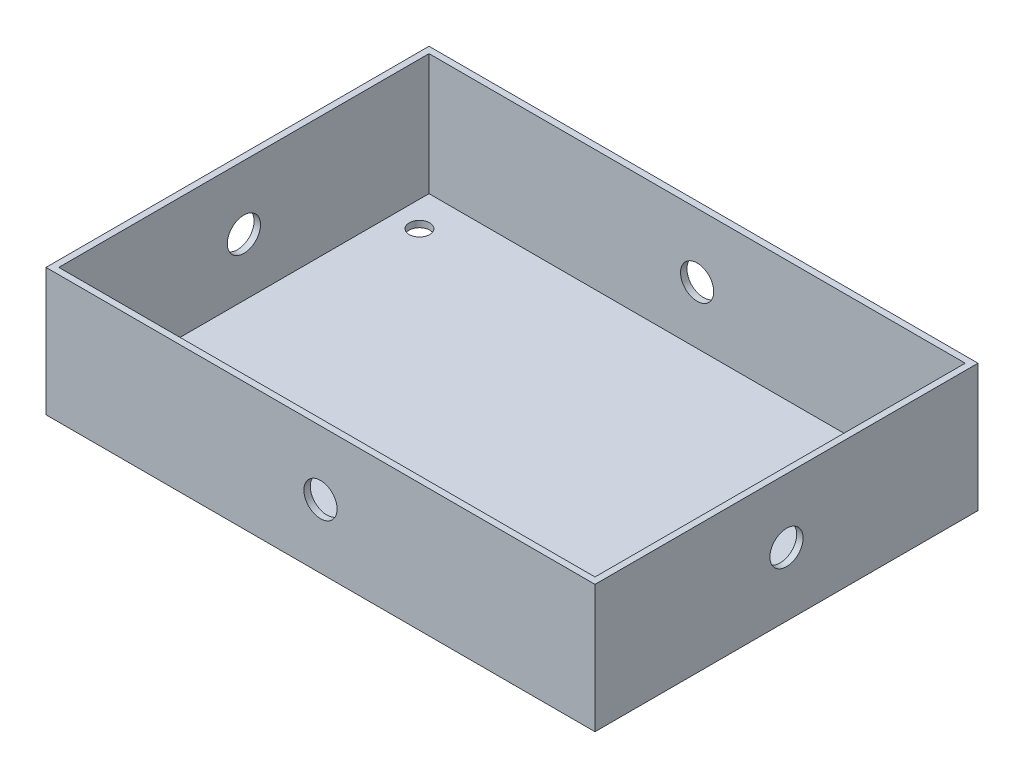
ISO-10303-21;
HEADER;
FILE_DESCRIPTION(('STEP AP214'),'2;1');
FILE_NAME('part.step','',(''),(''),'','','');
FILE_SCHEMA(('AUTOMOTIVE_DESIGN { 1 0 10303 214 1 1 1 1 }'));
ENDSEC;
DATA;
#1=APPLICATION_CONTEXT('core data for automotive mechanical design processes');
#2=APPLICATION_PROTOCOL_DEFINITION('international standard','automotive_design',2000,#1);
#3=PRODUCT_CONTEXT('',#1,'mechanical');
#4=PRODUCT('Part','Part','',(#3));
#5=PRODUCT_RELATED_PRODUCT_CATEGORY('part','',(#4));
#6=PRODUCT_DEFINITION_FORMATION('','',#4);
#7=PRODUCT_DEFINITION_CONTEXT('part definition',#1,'design');
#8=PRODUCT_DEFINITION('design','',#6,#7);
#9=PRODUCT_DEFINITION_SHAPE('','',#8);
#10=(LENGTH_UNIT() NAMED_UNIT(*) SI_UNIT(.MILLI.,.METRE.));
#11=(NAMED_UNIT(*) PLANE_ANGLE_UNIT() SI_UNIT($,.RADIAN.));
#12=(NAMED_UNIT(*) SI_UNIT($,.STERADIAN.) SOLID_ANGLE_UNIT());
#13=UNCERTAINTY_MEASURE_WITH_UNIT(LENGTH_MEASURE(1.E-05),#10,'distance_accuracy_value','');
#14=(GEOMETRIC_REPRESENTATION_CONTEXT(3) GLOBAL_UNCERTAINTY_ASSIGNED_CONTEXT((#13)) GLOBAL_UNIT_ASSIGNED_CONTEXT((#10,
#11,#12)) REPRESENTATION_CONTEXT('',''));
#15=CARTESIAN_POINT('',(0.,0.,0.));
#16=DIRECTION('',(0.,0.,1.));
#17=DIRECTION('',(1.,0.,0.));
#18=AXIS2_PLACEMENT_3D('',#15,#16,#17);
#19=CARTESIAN_POINT('',(43.,20.,30.));
#20=DIRECTION('',(-1.,0.,0.));
#21=DIRECTION('',(0.,0.,1.));
#22=AXIS2_PLACEMENT_3D('',#19,#20,#21);
#23=PLANE('',#22);
#24=CARTESIAN_POINT('',(43.,10.,0.));
#25=DIRECTION('',(-1.,0.,0.));
#26=DIRECTION('',(0.,0.,1.));
#27=AXIS2_PLACEMENT_3D('',#24,#25,#26);
#28=CIRCLE('',#27,2.6);
#29=CARTESIAN_POINT('',(43.,10.,2.6));
#30=VERTEX_POINT('',#29);
#31=EDGE_CURVE('E172',#30,#30,#28,.T.);
#32=ORIENTED_EDGE('',*,*,#31,.T.);
#33=EDGE_LOOP('',(#32));
#34=FACE_BOUND('',#33,.T.);
#35=DIRECTION('',(0.,0.,-1.));
#36=VECTOR('',#35,1.);
#37=CARTESIAN_POINT('',(43.,0.,30.));
#38=LINE('',#37,#36);
#39=CARTESIAN_POINT('',(43.,0.,30.));
#40=VERTEX_POINT('',#39);
#41=CARTESIAN_POINT('',(43.,0.,-30.));
#42=VERTEX_POINT('',#41);
#43=EDGE_CURVE('E150',#40,#42,#38,.T.);
#44=ORIENTED_EDGE('',*,*,#43,.T.);
#45=DIRECTION('',(0.,-1.,0.));
#46=VECTOR('',#45,1.);
#47=CARTESIAN_POINT('',(43.,20.,-30.));
#48=LINE('',#47,#46);
#49=CARTESIAN_POINT('',(43.,20.,-30.));
#50=VERTEX_POINT('',#49);
#51=EDGE_CURVE('E12',#50,#42,#48,.T.);
#52=ORIENTED_EDGE('',*,*,#51,.F.);
#53=DIRECTION('',(0.,0.,-1.));
#54=VECTOR('',#53,1.);
#55=CARTESIAN_POINT('',(43.,20.,30.));
#56=LINE('',#55,#54);
#57=CARTESIAN_POINT('',(43.,20.,30.));
#58=VERTEX_POINT('',#57);
#59=EDGE_CURVE('E151',#58,#50,#56,.T.);
#60=ORIENTED_EDGE('',*,*,#59,.F.);
#61=DIRECTION('',(0.,-1.,0.));
#62=VECTOR('',#61,1.);
#63=CARTESIAN_POINT('',(43.,20.,30.));
#64=LINE('',#63,#62);
#65=EDGE_CURVE('E157',#58,#40,#64,.T.);
#66=ORIENTED_EDGE('',*,*,#65,.T.);
#67=EDGE_LOOP('',(#44,#52,#60,#66));
#68=FACE_BOUND('',#67,.T.);
#69=ADVANCED_FACE('F37',(#34,#68),#23,.F.);
#70=CARTESIAN_POINT('',(-43.,20.,-30.));
#71=DIRECTION('',(0.,0.,1.));
#72=DIRECTION('',(1.,0.,0.));
#73=AXIS2_PLACEMENT_3D('',#70,#71,#72);
#74=PLANE('',#73);
#75=CARTESIAN_POINT('',(0.,10.,-30.));
#76=DIRECTION('',(0.,0.,-1.));
#77=DIRECTION('',(-1.,0.,0.));
#78=AXIS2_PLACEMENT_3D('',#75,#76,#77);
#79=CIRCLE('',#78,2.6);
#80=CARTESIAN_POINT('',(-2.59999999999999,10.,-30.));
#81=VERTEX_POINT('',#80);
#82=EDGE_CURVE('E267',#81,#81,#79,.T.);
#83=ORIENTED_EDGE('',*,*,#82,.F.);
#84=EDGE_LOOP('',(#83));
#85=FACE_BOUND('',#84,.T.);
#86=DIRECTION('',(-1.,0.,0.));
#87=VECTOR('',#86,1.);
#88=CARTESIAN_POINT('',(-43.,0.,-30.));
#89=LINE('',#88,#87);
#90=CARTESIAN_POINT('',(-43.,0.,-30.));
#91=VERTEX_POINT('',#90);
#92=EDGE_CURVE('E160',#42,#91,#89,.T.);
#93=ORIENTED_EDGE('',*,*,#92,.T.);
#94=DIRECTION('',(0.,-1.,0.));
#95=VECTOR('',#94,1.);
#96=CARTESIAN_POINT('',(-43.,20.,-30.));
#97=LINE('',#96,#95);
#98=CARTESIAN_POINT('',(-43.,20.,-30.));
#99=VERTEX_POINT('',#98);
#100=EDGE_CURVE('E45',#99,#91,#97,.T.);
#101=ORIENTED_EDGE('',*,*,#100,.F.);
#102=DIRECTION('',(-1.,0.,0.));
#103=VECTOR('',#102,1.);
#104=CARTESIAN_POINT('',(-43.,20.,-30.));
#105=LINE('',#104,#103);
#106=EDGE_CURVE('E90',#50,#99,#105,.T.);
#107=ORIENTED_EDGE('',*,*,#106,.F.);
#108=ORIENTED_EDGE('',*,*,#51,.T.);
#109=EDGE_LOOP('',(#93,#101,#107,#108));
#110=FACE_BOUND('',#109,.T.);
#111=ADVANCED_FACE('F226',(#85,#110),#74,.F.);
#112=CARTESIAN_POINT('',(-43.,20.,30.));
#113=DIRECTION('',(1.,0.,0.));
#114=DIRECTION('',(0.,0.,-1.));
#115=AXIS2_PLACEMENT_3D('',#112,#113,#114);
#116=PLANE('',#115);
#117=CARTESIAN_POINT('',(-43.,10.,0.));
#118=DIRECTION('',(-1.,0.,0.));
#119=DIRECTION('',(0.,0.,1.));
#120=AXIS2_PLACEMENT_3D('',#117,#118,#119);
#121=CIRCLE('',#120,2.6);
#122=CARTESIAN_POINT('',(-43.,10.,2.6));
#123=VERTEX_POINT('',#122);
#124=EDGE_CURVE('E179',#123,#123,#121,.T.);
#125=ORIENTED_EDGE('',*,*,#124,.F.);
#126=EDGE_LOOP('',(#125));
#127=FACE_BOUND('',#126,.T.);
#128=DIRECTION('',(0.,0.,1.));
#129=VECTOR('',#128,1.);
#130=CARTESIAN_POINT('',(-43.,0.,30.));
#131=LINE('',#130,#129);
#132=CARTESIAN_POINT('',(-43.,0.,30.));
#133=VERTEX_POINT('',#132);
#134=EDGE_CURVE('E162',#91,#133,#131,.T.);
#135=ORIENTED_EDGE('',*,*,#134,.T.);
#136=DIRECTION('',(0.,-1.,0.));
#137=VECTOR('',#136,1.);
#138=CARTESIAN_POINT('',(-43.,20.,30.));
#139=LINE('',#138,#137);
#140=CARTESIAN_POINT('',(-43.,20.,30.));
#141=VERTEX_POINT('',#140);
#142=EDGE_CURVE('E166',#141,#133,#139,.T.);
#143=ORIENTED_EDGE('',*,*,#142,.F.);
#144=DIRECTION('',(0.,0.,1.));
#145=VECTOR('',#144,1.);
#146=CARTESIAN_POINT('',(-43.,20.,30.));
#147=LINE('',#146,#145);
#148=EDGE_CURVE('E154',#99,#141,#147,.T.);
#149=ORIENTED_EDGE('',*,*,#148,.F.);
#150=ORIENTED_EDGE('',*,*,#100,.T.);
#151=EDGE_LOOP('',(#135,#143,#149,#150));
#152=FACE_BOUND('',#151,.T.);
#153=ADVANCED_FACE('F231',(#127,#152),#116,.F.);
#154=CARTESIAN_POINT('',(-43.,20.,30.));
#155=DIRECTION('',(0.,0.,-1.));
#156=DIRECTION('',(-1.,0.,0.));
#157=AXIS2_PLACEMENT_3D('',#154,#155,#156);
#158=PLANE('',#157);
#159=CARTESIAN_POINT('',(0.,10.,30.));
#160=DIRECTION('',(0.,0.,-1.));
#161=DIRECTION('',(-1.,0.,0.));
#162=AXIS2_PLACEMENT_3D('',#159,#160,#161);
#163=CIRCLE('',#162,2.6);
#164=CARTESIAN_POINT('',(-2.59999999999999,10.,30.));
#165=VERTEX_POINT('',#164);
#166=EDGE_CURVE('E265',#165,#165,#163,.T.);
#167=ORIENTED_EDGE('',*,*,#166,.T.);
#168=EDGE_LOOP('',(#167));
#169=FACE_BOUND('',#168,.T.);
#170=DIRECTION('',(1.,0.,0.));
#171=VECTOR('',#170,1.);
#172=CARTESIAN_POINT('',(-43.,0.,30.));
#173=LINE('',#172,#171);
#174=EDGE_CURVE('E83',#133,#40,#173,.T.);
#175=ORIENTED_EDGE('',*,*,#174,.T.);
#176=ORIENTED_EDGE('',*,*,#65,.F.);
#177=DIRECTION('',(1.,0.,0.));
#178=VECTOR('',#177,1.);
#179=CARTESIAN_POINT('',(-43.,20.,30.));
#180=LINE('',#179,#178);
#181=EDGE_CURVE('E62',#141,#58,#180,.T.);
#182=ORIENTED_EDGE('',*,*,#181,.F.);
#183=ORIENTED_EDGE('',*,*,#142,.T.);
#184=EDGE_LOOP('',(#175,#176,#182,#183));
#185=FACE_BOUND('',#184,.T.);
#186=ADVANCED_FACE('F220',(#169,#185),#158,.F.);
#187=CARTESIAN_POINT('',(0.,20.,0.));
#188=DIRECTION('',(0.,-1.,0.));
#189=DIRECTION('',(0.,0.,-1.));
#190=AXIS2_PLACEMENT_3D('',#187,#188,#189);
#191=PLANE('',#190);
#192=DIRECTION('',(0.,0.,1.));
#193=VECTOR('',#192,1.);
#194=CARTESIAN_POINT('',(-42.,20.,-29.));
#195=LINE('',#194,#193);
#196=CARTESIAN_POINT('',(-42.,20.,-29.));
#197=VERTEX_POINT('',#196);
#198=CARTESIAN_POINT('',(-42.,20.,29.));
#199=VERTEX_POINT('',#198);
#200=EDGE_CURVE('E136',#197,#199,#195,.T.);
#201=ORIENTED_EDGE('',*,*,#200,.F.);
#202=DIRECTION('',(-1.,0.,0.));
#203=VECTOR('',#202,1.);
#204=CARTESIAN_POINT('',(-42.,20.,-29.));
#205=LINE('',#204,#203);
#206=CARTESIAN_POINT('',(42.,20.,-29.));
#207=VERTEX_POINT('',#206);
#208=EDGE_CURVE('E129',#207,#197,#205,.T.);
#209=ORIENTED_EDGE('',*,*,#208,.F.);
#210=DIRECTION('',(0.,0.,-1.));
#211=VECTOR('',#210,1.);
#212=CARTESIAN_POINT('',(42.,20.,-29.));
#213=LINE('',#212,#211);
#214=CARTESIAN_POINT('',(42.,20.,29.));
#215=VERTEX_POINT('',#214);
#216=EDGE_CURVE('E140',#215,#207,#213,.T.);
#217=ORIENTED_EDGE('',*,*,#216,.F.);
#218=DIRECTION('',(1.,0.,0.));
#219=VECTOR('',#218,1.);
#220=CARTESIAN_POINT('',(-42.,20.,29.));
#221=LINE('',#220,#219);
#222=EDGE_CURVE('E53',#199,#215,#221,.T.);
#223=ORIENTED_EDGE('',*,*,#222,.F.);
#224=EDGE_LOOP('',(#201,#209,#217,#223));
#225=FACE_BOUND('',#224,.T.);
#226=ORIENTED_EDGE('',*,*,#59,.T.);
#227=ORIENTED_EDGE('',*,*,#106,.T.);
#228=ORIENTED_EDGE('',*,*,#148,.T.);
#229=ORIENTED_EDGE('',*,*,#181,.T.);
#230=EDGE_LOOP('',(#226,#227,#228,#229));
#231=FACE_BOUND('',#230,.T.);
#232=ADVANCED_FACE('F217',(#225,#231),#191,.F.);
#233=CARTESIAN_POINT('',(0.,0.,0.));
#234=DIRECTION('',(0.,-1.,0.));
#235=DIRECTION('',(0.,0.,-1.));
#236=AXIS2_PLACEMENT_3D('',#233,#234,#235);
#237=PLANE('',#236);
#238=CARTESIAN_POINT('',(-38.,0.,-23.5));
#239=DIRECTION('',(0.,-1.,0.));
#240=DIRECTION('',(0.,0.,1.));
#241=AXIS2_PLACEMENT_3D('',#238,#239,#240);
#242=CIRCLE('',#241,1.6);
#243=CARTESIAN_POINT('',(-38.,0.,-21.9));
#244=VERTEX_POINT('',#243);
#245=EDGE_CURVE('E176',#244,#244,#242,.T.);
#246=ORIENTED_EDGE('',*,*,#245,.F.);
#247=EDGE_LOOP('',(#246));
#248=FACE_BOUND('',#247,.T.);
#249=CARTESIAN_POINT('',(38.,0.,-23.5));
#250=DIRECTION('',(0.,-1.,0.));
#251=DIRECTION('',(0.,0.,-1.));
#252=AXIS2_PLACEMENT_3D('',#249,#250,#251);
#253=CIRCLE('',#252,1.6);
#254=CARTESIAN_POINT('',(38.,0.,-25.1));
#255=VERTEX_POINT('',#254);
#256=EDGE_CURVE('E199',#255,#255,#253,.T.);
#257=ORIENTED_EDGE('',*,*,#256,.F.);
#258=EDGE_LOOP('',(#257));
#259=FACE_BOUND('',#258,.T.);
#260=CARTESIAN_POINT('',(38.,0.,23.5));
#261=DIRECTION('',(0.,-1.,0.));
#262=DIRECTION('',(0.,0.,1.));
#263=AXIS2_PLACEMENT_3D('',#260,#261,#262);
#264=CIRCLE('',#263,1.6);
#265=CARTESIAN_POINT('',(38.,0.,25.1));
#266=VERTEX_POINT('',#265);
#267=EDGE_CURVE('E193',#266,#266,#264,.T.);
#268=ORIENTED_EDGE('',*,*,#267,.F.);
#269=EDGE_LOOP('',(#268));
#270=FACE_BOUND('',#269,.T.);
#271=CARTESIAN_POINT('',(-38.,0.,23.5));
#272=DIRECTION('',(0.,-1.,0.));
#273=DIRECTION('',(0.,0.,-1.));
#274=AXIS2_PLACEMENT_3D('',#271,#272,#273);
#275=CIRCLE('',#274,1.6);
#276=CARTESIAN_POINT('',(-38.,0.,21.9));
#277=VERTEX_POINT('',#276);
#278=EDGE_CURVE('E192',#277,#277,#275,.T.);
#279=ORIENTED_EDGE('',*,*,#278,.F.);
#280=EDGE_LOOP('',(#279));
#281=FACE_BOUND('',#280,.T.);
#282=ORIENTED_EDGE('',*,*,#43,.F.);
#283=ORIENTED_EDGE('',*,*,#174,.F.);
#284=ORIENTED_EDGE('',*,*,#134,.F.);
#285=ORIENTED_EDGE('',*,*,#92,.F.);
#286=EDGE_LOOP('',(#282,#283,#284,#285));
#287=FACE_BOUND('',#286,.T.);
#288=ADVANCED_FACE('F219',(#248,#259,#270,#281,#287),#237,.T.);
#289=CARTESIAN_POINT('',(0.,1.,0.));
#290=DIRECTION('',(0.,-1.,0.));
#291=DIRECTION('',(0.,0.,-1.));
#292=AXIS2_PLACEMENT_3D('',#289,#290,#291);
#293=PLANE('',#292);
#294=CARTESIAN_POINT('',(-38.,1.,-23.5));
#295=DIRECTION('',(0.,-1.,0.));
#296=DIRECTION('',(0.,0.,1.));
#297=AXIS2_PLACEMENT_3D('',#294,#295,#296);
#298=CIRCLE('',#297,1.6);
#299=CARTESIAN_POINT('',(-38.,1.,-21.9));
#300=VERTEX_POINT('',#299);
#301=EDGE_CURVE('E202',#300,#300,#298,.T.);
#302=ORIENTED_EDGE('',*,*,#301,.T.);
#303=EDGE_LOOP('',(#302));
#304=FACE_BOUND('',#303,.T.);
#305=CARTESIAN_POINT('',(38.,1.,-23.5));
#306=DIRECTION('',(0.,-1.,0.));
#307=DIRECTION('',(0.,0.,-1.));
#308=AXIS2_PLACEMENT_3D('',#305,#306,#307);
#309=CIRCLE('',#308,1.6);
#310=CARTESIAN_POINT('',(38.,1.,-25.1));
#311=VERTEX_POINT('',#310);
#312=EDGE_CURVE('E196',#311,#311,#309,.T.);
#313=ORIENTED_EDGE('',*,*,#312,.T.);
#314=EDGE_LOOP('',(#313));
#315=FACE_BOUND('',#314,.T.);
#316=CARTESIAN_POINT('',(38.,1.,23.5));
#317=DIRECTION('',(0.,-1.,0.));
#318=DIRECTION('',(0.,0.,1.));
#319=AXIS2_PLACEMENT_3D('',#316,#317,#318);
#320=CIRCLE('',#319,1.6);
#321=CARTESIAN_POINT('',(38.,1.,25.1));
#322=VERTEX_POINT('',#321);
#323=EDGE_CURVE('E189',#322,#322,#320,.T.);
#324=ORIENTED_EDGE('',*,*,#323,.T.);
#325=EDGE_LOOP('',(#324));
#326=FACE_BOUND('',#325,.T.);
#327=CARTESIAN_POINT('',(-38.,1.,23.5));
#328=DIRECTION('',(0.,-1.,0.));
#329=DIRECTION('',(0.,0.,-1.));
#330=AXIS2_PLACEMENT_3D('',#327,#328,#329);
#331=CIRCLE('',#330,1.6);
#332=CARTESIAN_POINT('',(-38.,1.,21.9));
#333=VERTEX_POINT('',#332);
#334=EDGE_CURVE('E207',#333,#333,#331,.T.);
#335=ORIENTED_EDGE('',*,*,#334,.T.);
#336=EDGE_LOOP('',(#335));
#337=FACE_BOUND('',#336,.T.);
#338=DIRECTION('',(0.,0.,-1.));
#339=VECTOR('',#338,1.);
#340=CARTESIAN_POINT('',(42.,1.,-29.));
#341=LINE('',#340,#339);
#342=CARTESIAN_POINT('',(42.,1.,29.));
#343=VERTEX_POINT('',#342);
#344=CARTESIAN_POINT('',(42.,1.,-29.));
#345=VERTEX_POINT('',#344);
#346=EDGE_CURVE('E133',#343,#345,#341,.T.);
#347=ORIENTED_EDGE('',*,*,#346,.T.);
#348=DIRECTION('',(-1.,0.,0.));
#349=VECTOR('',#348,1.);
#350=CARTESIAN_POINT('',(-42.,1.,-29.));
#351=LINE('',#350,#349);
#352=CARTESIAN_POINT('',(-42.,1.,-29.));
#353=VERTEX_POINT('',#352);
#354=EDGE_CURVE('E126',#345,#353,#351,.T.);
#355=ORIENTED_EDGE('',*,*,#354,.T.);
#356=DIRECTION('',(0.,0.,1.));
#357=VECTOR('',#356,1.);
#358=CARTESIAN_POINT('',(-42.,1.,-29.));
#359=LINE('',#358,#357);
#360=CARTESIAN_POINT('',(-42.,1.,29.));
#361=VERTEX_POINT('',#360);
#362=EDGE_CURVE('E113',#353,#361,#359,.T.);
#363=ORIENTED_EDGE('',*,*,#362,.T.);
#364=DIRECTION('',(1.,0.,0.));
#365=VECTOR('',#364,1.);
#366=CARTESIAN_POINT('',(-42.,1.,29.));
#367=LINE('',#366,#365);
#368=EDGE_CURVE('E145',#361,#343,#367,.T.);
#369=ORIENTED_EDGE('',*,*,#368,.T.);
#370=EDGE_LOOP('',(#347,#355,#363,#369));
#371=FACE_BOUND('',#370,.T.);
#372=ADVANCED_FACE('F132',(#304,#315,#326,#337,#371),#293,.F.);
#373=CARTESIAN_POINT('',(-42.,-102.078401241399,-29.));
#374=DIRECTION('',(0.,0.,-1.));
#375=DIRECTION('',(-1.,0.,0.));
#376=AXIS2_PLACEMENT_3D('',#373,#374,#375);
#377=PLANE('',#376);
#378=CARTESIAN_POINT('',(0.,10.,-29.));
#379=DIRECTION('',(0.,0.,-1.));
#380=DIRECTION('',(-1.,0.,0.));
#381=AXIS2_PLACEMENT_3D('',#378,#379,#380);
#382=CIRCLE('',#381,2.6);
#383=CARTESIAN_POINT('',(-2.59999999999999,10.,-29.));
#384=VERTEX_POINT('',#383);
#385=EDGE_CURVE('E184',#384,#384,#382,.T.);
#386=ORIENTED_EDGE('',*,*,#385,.T.);
#387=EDGE_LOOP('',(#386));
#388=FACE_BOUND('',#387,.T.);
#389=DIRECTION('',(0.,1.,0.));
#390=VECTOR('',#389,1.);
#391=CARTESIAN_POINT('',(42.,-102.078401241399,-29.));
#392=LINE('',#391,#390);
#393=EDGE_CURVE('E143',#345,#207,#392,.T.);
#394=ORIENTED_EDGE('',*,*,#393,.T.);
#395=ORIENTED_EDGE('',*,*,#208,.T.);
#396=DIRECTION('',(0.,1.,0.));
#397=VECTOR('',#396,1.);
#398=CARTESIAN_POINT('',(-42.,-102.078401241399,-29.));
#399=LINE('',#398,#397);
#400=EDGE_CURVE('E117',#353,#197,#399,.T.);
#401=ORIENTED_EDGE('',*,*,#400,.F.);
#402=ORIENTED_EDGE('',*,*,#354,.F.);
#403=EDGE_LOOP('',(#394,#395,#401,#402));
#404=FACE_BOUND('',#403,.T.);
#405=ADVANCED_FACE('F125',(#388,#404),#377,.F.);
#406=CARTESIAN_POINT('',(-42.,-102.078401241399,-29.));
#407=DIRECTION('',(-1.,0.,0.));
#408=DIRECTION('',(0.,0.,1.));
#409=AXIS2_PLACEMENT_3D('',#406,#407,#408);
#410=PLANE('',#409);
#411=CARTESIAN_POINT('',(-42.,10.,0.));
#412=DIRECTION('',(-1.,0.,0.));
#413=DIRECTION('',(0.,0.,1.));
#414=AXIS2_PLACEMENT_3D('',#411,#412,#413);
#415=CIRCLE('',#414,2.6);
#416=CARTESIAN_POINT('',(-42.,10.,2.6));
#417=VERTEX_POINT('',#416);
#418=EDGE_CURVE('E171',#417,#417,#415,.T.);
#419=ORIENTED_EDGE('',*,*,#418,.T.);
#420=EDGE_LOOP('',(#419));
#421=FACE_BOUND('',#420,.T.);
#422=ORIENTED_EDGE('',*,*,#400,.T.);
#423=ORIENTED_EDGE('',*,*,#200,.T.);
#424=DIRECTION('',(0.,1.,0.));
#425=VECTOR('',#424,1.);
#426=CARTESIAN_POINT('',(-42.,-102.078401241399,29.));
#427=LINE('',#426,#425);
#428=EDGE_CURVE('E119',#361,#199,#427,.T.);
#429=ORIENTED_EDGE('',*,*,#428,.F.);
#430=ORIENTED_EDGE('',*,*,#362,.F.);
#431=EDGE_LOOP('',(#422,#423,#429,#430));
#432=FACE_BOUND('',#431,.T.);
#433=ADVANCED_FACE('F115',(#421,#432),#410,.F.);
#434=CARTESIAN_POINT('',(-42.,-102.078401241399,29.));
#435=DIRECTION('',(0.,0.,1.));
#436=DIRECTION('',(1.,0.,0.));
#437=AXIS2_PLACEMENT_3D('',#434,#435,#436);
#438=PLANE('',#437);
#439=CARTESIAN_POINT('',(0.,10.,29.));
#440=DIRECTION('',(0.,0.,1.));
#441=DIRECTION('',(1.,0.,0.));
#442=AXIS2_PLACEMENT_3D('',#439,#440,#441);
#443=CIRCLE('',#442,2.6);
#444=CARTESIAN_POINT('',(2.60000000000001,10.,29.));
#445=VERTEX_POINT('',#444);
#446=EDGE_CURVE('E40',#445,#445,#443,.T.);
#447=ORIENTED_EDGE('',*,*,#446,.T.);
#448=EDGE_LOOP('',(#447));
#449=FACE_BOUND('',#448,.T.);
#450=ORIENTED_EDGE('',*,*,#428,.T.);
#451=ORIENTED_EDGE('',*,*,#222,.T.);
#452=DIRECTION('',(0.,1.,0.));
#453=VECTOR('',#452,1.);
#454=CARTESIAN_POINT('',(42.,-102.078401241399,29.));
#455=LINE('',#454,#453);
#456=EDGE_CURVE('E144',#343,#215,#455,.T.);
#457=ORIENTED_EDGE('',*,*,#456,.F.);
#458=ORIENTED_EDGE('',*,*,#368,.F.);
#459=EDGE_LOOP('',(#450,#451,#457,#458));
#460=FACE_BOUND('',#459,.T.);
#461=ADVANCED_FACE('F285',(#449,#460),#438,.F.);
#462=CARTESIAN_POINT('',(42.,-102.078401241399,-29.));
#463=DIRECTION('',(1.,0.,0.));
#464=DIRECTION('',(0.,0.,-1.));
#465=AXIS2_PLACEMENT_3D('',#462,#463,#464);
#466=PLANE('',#465);
#467=CARTESIAN_POINT('',(42.,10.,0.));
#468=DIRECTION('',(1.,0.,0.));
#469=DIRECTION('',(0.,0.,-1.));
#470=AXIS2_PLACEMENT_3D('',#467,#468,#469);
#471=CIRCLE('',#470,2.6);
#472=CARTESIAN_POINT('',(42.,10.,-2.6));
#473=VERTEX_POINT('',#472);
#474=EDGE_CURVE('E169',#473,#473,#471,.T.);
#475=ORIENTED_EDGE('',*,*,#474,.T.);
#476=EDGE_LOOP('',(#475));
#477=FACE_BOUND('',#476,.T.);
#478=ORIENTED_EDGE('',*,*,#456,.T.);
#479=ORIENTED_EDGE('',*,*,#216,.T.);
#480=ORIENTED_EDGE('',*,*,#393,.F.);
#481=ORIENTED_EDGE('',*,*,#346,.F.);
#482=EDGE_LOOP('',(#478,#479,#480,#481));
#483=FACE_BOUND('',#482,.T.);
#484=ADVANCED_FACE('F215',(#477,#483),#466,.F.);
#485=CARTESIAN_POINT('',(-38.,1.,23.5));
#486=DIRECTION('',(0.,-1.,0.));
#487=DIRECTION('',(0.,0.,-1.));
#488=AXIS2_PLACEMENT_3D('',#485,#486,#487);
#489=CYLINDRICAL_SURFACE('',#488,1.6);
#490=ORIENTED_EDGE('',*,*,#334,.F.);
#491=EDGE_LOOP('',(#490));
#492=FACE_BOUND('',#491,.T.);
#493=ORIENTED_EDGE('',*,*,#278,.T.);
#494=EDGE_LOOP('',(#493));
#495=FACE_BOUND('',#494,.T.);
#496=ADVANCED_FACE('F293',(#492,#495),#489,.F.);
#497=CARTESIAN_POINT('',(38.,1.,23.5));
#498=DIRECTION('',(0.,-1.,0.));
#499=DIRECTION('',(0.,0.,-1.));
#500=AXIS2_PLACEMENT_3D('',#497,#498,#499);
#501=CYLINDRICAL_SURFACE('',#500,1.6);
#502=ORIENTED_EDGE('',*,*,#323,.F.);
#503=EDGE_LOOP('',(#502));
#504=FACE_BOUND('',#503,.T.);
#505=ORIENTED_EDGE('',*,*,#267,.T.);
#506=EDGE_LOOP('',(#505));
#507=FACE_BOUND('',#506,.T.);
#508=ADVANCED_FACE('F296',(#504,#507),#501,.F.);
#509=CARTESIAN_POINT('',(38.,1.,-23.5));
#510=DIRECTION('',(0.,-1.,0.));
#511=DIRECTION('',(0.,0.,-1.));
#512=AXIS2_PLACEMENT_3D('',#509,#510,#511);
#513=CYLINDRICAL_SURFACE('',#512,1.6);
#514=ORIENTED_EDGE('',*,*,#312,.F.);
#515=EDGE_LOOP('',(#514));
#516=FACE_BOUND('',#515,.T.);
#517=ORIENTED_EDGE('',*,*,#256,.T.);
#518=EDGE_LOOP('',(#517));
#519=FACE_BOUND('',#518,.T.);
#520=ADVANCED_FACE('F302',(#516,#519),#513,.F.);
#521=CARTESIAN_POINT('',(-38.,1.,-23.5));
#522=DIRECTION('',(0.,-1.,0.));
#523=DIRECTION('',(0.,0.,-1.));
#524=AXIS2_PLACEMENT_3D('',#521,#522,#523);
#525=CYLINDRICAL_SURFACE('',#524,1.6);
#526=ORIENTED_EDGE('',*,*,#301,.F.);
#527=EDGE_LOOP('',(#526));
#528=FACE_BOUND('',#527,.T.);
#529=ORIENTED_EDGE('',*,*,#245,.T.);
#530=EDGE_LOOP('',(#529));
#531=FACE_BOUND('',#530,.T.);
#532=ADVANCED_FACE('F298',(#528,#531),#525,.F.);
#533=CARTESIAN_POINT('',(43.,10.,0.));
#534=DIRECTION('',(-1.,0.,0.));
#535=DIRECTION('',(0.,0.,1.));
#536=AXIS2_PLACEMENT_3D('',#533,#534,#535);
#537=CYLINDRICAL_SURFACE('',#536,2.6);
#538=ORIENTED_EDGE('',*,*,#31,.F.);
#539=EDGE_LOOP('',(#538));
#540=FACE_BOUND('',#539,.T.);
#541=ORIENTED_EDGE('',*,*,#474,.F.);
#542=EDGE_LOOP('',(#541));
#543=FACE_BOUND('',#542,.T.);
#544=ADVANCED_FACE('F301',(#540,#543),#537,.F.);
#545=ORIENTED_EDGE('',*,*,#124,.T.);
#546=EDGE_LOOP('',(#545));
#547=FACE_BOUND('',#546,.T.);
#548=ORIENTED_EDGE('',*,*,#418,.F.);
#549=EDGE_LOOP('',(#548));
#550=FACE_BOUND('',#549,.T.);
#551=ADVANCED_FACE('F310',(#547,#550),#537,.F.);
#552=CARTESIAN_POINT('',(0.,10.,30.));
#553=DIRECTION('',(0.,0.,-1.));
#554=DIRECTION('',(-1.,0.,0.));
#555=AXIS2_PLACEMENT_3D('',#552,#553,#554);
#556=CYLINDRICAL_SURFACE('',#555,2.6);
#557=ORIENTED_EDGE('',*,*,#166,.F.);
#558=EDGE_LOOP('',(#557));
#559=FACE_BOUND('',#558,.T.);
#560=ORIENTED_EDGE('',*,*,#446,.F.);
#561=EDGE_LOOP('',(#560));
#562=FACE_BOUND('',#561,.T.);
#563=ADVANCED_FACE('F275',(#559,#562),#556,.F.);
#564=ORIENTED_EDGE('',*,*,#82,.T.);
#565=EDGE_LOOP('',(#564));
#566=FACE_BOUND('',#565,.T.);
#567=ORIENTED_EDGE('',*,*,#385,.F.);
#568=EDGE_LOOP('',(#567));
#569=FACE_BOUND('',#568,.T.);
#570=ADVANCED_FACE('F272',(#566,#569),#556,.F.);
#571=CLOSED_SHELL('',(#69,#111,#153,#186,#232,#288,#372,#405,#433,#461,#484,#496,#508,#520,#532,
#544,#551,#563,#570));
#572=MANIFOLD_SOLID_BREP('B2',#571);
#573=ADVANCED_BREP_SHAPE_REPRESENTATION('',(#18,#572),#14);
#574=SHAPE_DEFINITION_REPRESENTATION(#9,#573);
ENDSEC;
END-ISO-10303-21;
